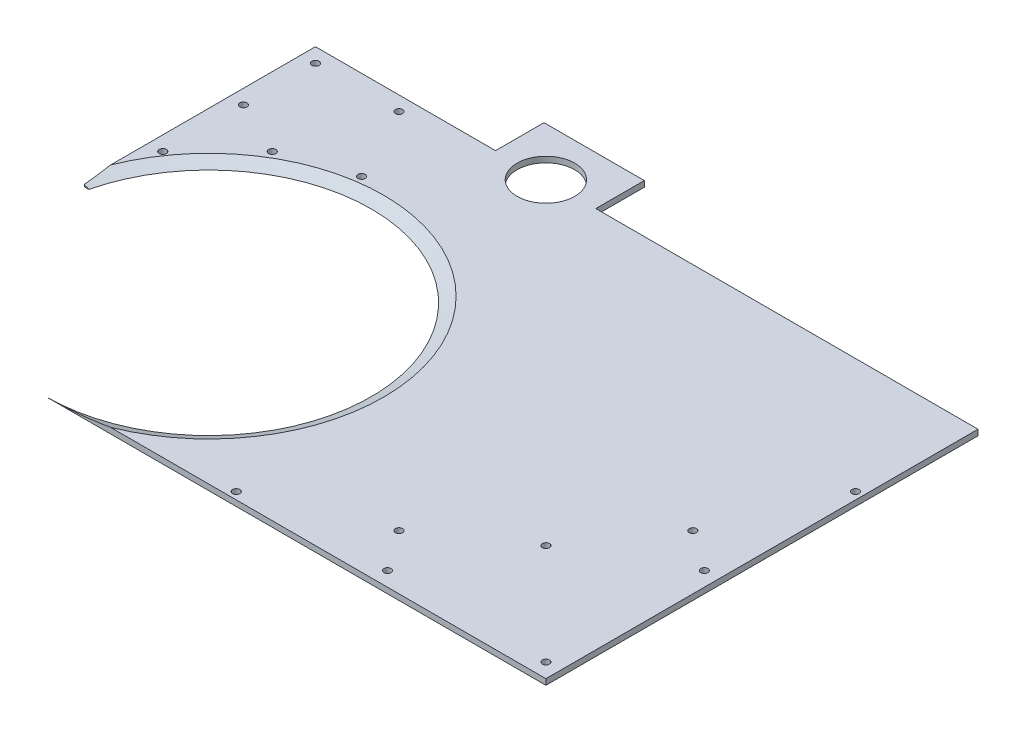
ISO-10303-21;
HEADER;
FILE_DESCRIPTION(('STEP AP214'),'2;1');
FILE_NAME('part.step','',(''),(''),'','','');
FILE_SCHEMA(('AUTOMOTIVE_DESIGN { 1 0 10303 214 1 1 1 1 }'));
ENDSEC;
DATA;
#1=APPLICATION_CONTEXT('core data for automotive mechanical design processes');
#2=APPLICATION_PROTOCOL_DEFINITION('international standard','automotive_design',2000,#1);
#3=PRODUCT_CONTEXT('',#1,'mechanical');
#4=PRODUCT('Part','Part','',(#3));
#5=PRODUCT_RELATED_PRODUCT_CATEGORY('part','',(#4));
#6=PRODUCT_DEFINITION_FORMATION('','',#4);
#7=PRODUCT_DEFINITION_CONTEXT('part definition',#1,'design');
#8=PRODUCT_DEFINITION('design','',#6,#7);
#9=PRODUCT_DEFINITION_SHAPE('','',#8);
#10=(LENGTH_UNIT() NAMED_UNIT(*) SI_UNIT(.MILLI.,.METRE.));
#11=(NAMED_UNIT(*) PLANE_ANGLE_UNIT() SI_UNIT($,.RADIAN.));
#12=(NAMED_UNIT(*) SI_UNIT($,.STERADIAN.) SOLID_ANGLE_UNIT());
#13=UNCERTAINTY_MEASURE_WITH_UNIT(LENGTH_MEASURE(1.E-05),#10,'distance_accuracy_value','');
#14=(GEOMETRIC_REPRESENTATION_CONTEXT(3) GLOBAL_UNCERTAINTY_ASSIGNED_CONTEXT((#13)) GLOBAL_UNIT_ASSIGNED_CONTEXT((#10,
#11,#12)) REPRESENTATION_CONTEXT('',''));
#15=CARTESIAN_POINT('',(0.,0.,0.));
#16=DIRECTION('',(0.,0.,1.));
#17=DIRECTION('',(1.,0.,0.));
#18=AXIS2_PLACEMENT_3D('',#15,#16,#17);
#19=CARTESIAN_POINT('',(-203.2,38.1,0.));
#20=DIRECTION('',(0.,0.,-1.));
#21=DIRECTION('',(-1.,0.,0.));
#22=AXIS2_PLACEMENT_3D('',#19,#20,#21);
#23=PLANE('',#22);
#24=DIRECTION('',(1.,0.,0.));
#25=VECTOR('',#24,1.);
#26=CARTESIAN_POINT('',(-203.2,38.1,0.));
#27=LINE('',#26,#25);
#28=CARTESIAN_POINT('',(-2.8464381738908,38.1,0.));
#29=VERTEX_POINT('',#28);
#30=CARTESIAN_POINT('',(381.,38.1,0.));
#31=VERTEX_POINT('',#30);
#32=EDGE_CURVE('E259',#29,#31,#27,.T.);
#33=ORIENTED_EDGE('',*,*,#32,.F.);
#34=CARTESIAN_POINT('',(-2.8464381738908,38.1,0.));
#35=CARTESIAN_POINT('',(-5.19891630009192,37.6950979624826,0.));
#36=CARTESIAN_POINT('',(-7.5550744164869,37.3112790542011,0.));
#37=CARTESIAN_POINT('',(-12.2743507992195,36.5883245990041,0.));
#38=CARTESIAN_POINT('',(-14.6374694133203,36.2491913247769,0.));
#39=CARTESIAN_POINT('',(-19.3656398538386,35.6187519823703,0.));
#40=CARTESIAN_POINT('',(-21.7306799700376,35.3273583940769,0.));
#41=CARTESIAN_POINT('',(-26.4663000631169,34.7939460535547,0.));
#42=CARTESIAN_POINT('',(-28.836879960786,34.5519265996604,0.));
#43=CARTESIAN_POINT('',(-33.5832522205353,34.1192539450888,0.));
#44=CARTESIAN_POINT('',(-35.9590455944232,33.9286118080349,0.));
#45=CARTESIAN_POINT('',(-40.7143004387169,33.6004543608359,0.));
#46=CARTESIAN_POINT('',(-43.093761905802,33.4629390026246,0.));
#47=CARTESIAN_POINT('',(-47.8596191736278,33.2421042931139,0.));
#48=CARTESIAN_POINT('',(-50.2460196764281,33.1588851643232,0.));
#49=CARTESIAN_POINT('',(-53.8265716244745,33.0755926672568,0.));
#50=CARTESIAN_POINT('',(-55.0202717796195,33.0547511994624,0.));
#51=CARTESIAN_POINT('',(-57.407835976874,33.0269527678862,0.));
#52=CARTESIAN_POINT('',(-58.6017000192947,33.0199958308439,0.));
#53=CARTESIAN_POINT('',(-59.7955752031906,33.0199999999999,0.));
#54=B_SPLINE_CURVE_WITH_KNOTS('',3,(#34,#35,#36,#37,#38,#39,#40,#41,#42,#43,#44,#45,#46,#47,#48,
#49,#50,#51,#52,#53),.UNSPECIFIED.,.F.,.F.,(4,2,2,2,2,2,2,2,2,4),(0.,7.16118637263134,
14.3227368190655,21.4710075700052,28.61917672839,35.7688839502196,42.9185847033745,
50.0814456483104,53.6630219259592,57.2446051011548),.UNSPECIFIED.);
#55=CARTESIAN_POINT('',(-59.7955752031906,33.02,0.));
#56=VERTEX_POINT('',#55);
#57=EDGE_CURVE('E60',#29,#56,#54,.T.);
#58=ORIENTED_EDGE('',*,*,#57,.T.);
#59=DIRECTION('',(1.,0.,0.));
#60=VECTOR('',#59,1.);
#61=CARTESIAN_POINT('',(-203.2,33.02,0.));
#62=LINE('',#61,#60);
#63=CARTESIAN_POINT('',(381.,33.02,0.));
#64=VERTEX_POINT('',#63);
#65=EDGE_CURVE('E135',#56,#64,#62,.T.);
#66=ORIENTED_EDGE('',*,*,#65,.T.);
#67=DIRECTION('',(0.,-1.,0.));
#68=VECTOR('',#67,1.);
#69=CARTESIAN_POINT('',(381.,38.1,0.));
#70=LINE('',#69,#68);
#71=EDGE_CURVE('E174',#31,#64,#70,.T.);
#72=ORIENTED_EDGE('',*,*,#71,.F.);
#73=EDGE_LOOP('',(#33,#58,#66,#72));
#74=FACE_BOUND('',#73,.T.);
#75=ADVANCED_FACE('F33',(#74),#23,.F.);
#76=CARTESIAN_POINT('',(0.,38.1,0.));
#77=DIRECTION('',(0.,1.,0.));
#78=DIRECTION('',(0.,0.,1.));
#79=AXIS2_PLACEMENT_3D('',#76,#77,#78);
#80=PLANE('',#79);
#81=CARTESIAN_POINT('',(-190.5,38.1,-233.68));
#82=DIRECTION('',(0.,1.,0.));
#83=DIRECTION('',(0.,0.,1.));
#84=AXIS2_PLACEMENT_3D('',#81,#82,#83);
#85=CIRCLE('',#84,3.17499999999997);
#86=CARTESIAN_POINT('',(-190.5,38.1,-230.505));
#87=VERTEX_POINT('',#86);
#88=EDGE_CURVE('E343',#87,#87,#85,.T.);
#89=ORIENTED_EDGE('',*,*,#88,.F.);
#90=EDGE_LOOP('',(#89));
#91=FACE_BOUND('',#90,.T.);
#92=CARTESIAN_POINT('',(-190.5,38.1,-304.8));
#93=DIRECTION('',(0.,1.,0.));
#94=DIRECTION('',(0.,0.,1.));
#95=AXIS2_PLACEMENT_3D('',#92,#93,#94);
#96=CIRCLE('',#95,3.17499999999997);
#97=CARTESIAN_POINT('',(-190.5,38.1,-301.625));
#98=VERTEX_POINT('',#97);
#99=EDGE_CURVE('E337',#98,#98,#96,.T.);
#100=ORIENTED_EDGE('',*,*,#99,.F.);
#101=EDGE_LOOP('',(#100));
#102=FACE_BOUND('',#101,.T.);
#103=CARTESIAN_POINT('',(-142.24,38.1,-281.94));
#104=DIRECTION('',(0.,1.,0.));
#105=DIRECTION('',(0.,0.,1.));
#106=AXIS2_PLACEMENT_3D('',#103,#104,#105);
#107=CIRCLE('',#106,3.175);
#108=CARTESIAN_POINT('',(-142.24,38.1,-278.765));
#109=VERTEX_POINT('',#108);
#110=EDGE_CURVE('E331',#109,#109,#107,.T.);
#111=ORIENTED_EDGE('',*,*,#110,.F.);
#112=EDGE_LOOP('',(#111));
#113=FACE_BOUND('',#112,.T.);
#114=CARTESIAN_POINT('',(-83.82,38.1,-302.26));
#115=DIRECTION('',(0.,1.,0.));
#116=DIRECTION('',(0.,0.,1.));
#117=AXIS2_PLACEMENT_3D('',#114,#115,#116);
#118=CIRCLE('',#117,3.175);
#119=CARTESIAN_POINT('',(-83.82,38.1,-299.085));
#120=VERTEX_POINT('',#119);
#121=EDGE_CURVE('E325',#120,#120,#118,.T.);
#122=ORIENTED_EDGE('',*,*,#121,.F.);
#123=EDGE_LOOP('',(#122));
#124=FACE_BOUND('',#123,.T.);
#125=CARTESIAN_POINT('',(-116.84,38.1,-368.3));
#126=DIRECTION('',(0.,1.,0.));
#127=DIRECTION('',(0.,0.,1.));
#128=AXIS2_PLACEMENT_3D('',#125,#126,#127);
#129=CIRCLE('',#128,3.175);
#130=CARTESIAN_POINT('',(-116.84,38.1,-365.125));
#131=VERTEX_POINT('',#130);
#132=EDGE_CURVE('E319',#131,#131,#129,.T.);
#133=ORIENTED_EDGE('',*,*,#132,.F.);
#134=EDGE_LOOP('',(#133));
#135=FACE_BOUND('',#134,.T.);
#136=CARTESIAN_POINT('',(-190.5,38.1,-368.3));
#137=DIRECTION('',(0.,1.,0.));
#138=DIRECTION('',(0.,0.,1.));
#139=AXIS2_PLACEMENT_3D('',#136,#137,#138);
#140=CIRCLE('',#139,3.17499999999997);
#141=CARTESIAN_POINT('',(-190.5,38.1,-365.125));
#142=VERTEX_POINT('',#141);
#143=EDGE_CURVE('E313',#142,#142,#140,.T.);
#144=ORIENTED_EDGE('',*,*,#143,.F.);
#145=EDGE_LOOP('',(#144));
#146=FACE_BOUND('',#145,.T.);
#147=CARTESIAN_POINT('',(368.3,38.1,-12.7));
#148=DIRECTION('',(0.,1.,0.));
#149=DIRECTION('',(0.,0.,1.));
#150=AXIS2_PLACEMENT_3D('',#147,#148,#149);
#151=CIRCLE('',#150,3.17500000000003);
#152=CARTESIAN_POINT('',(368.3,38.1,-9.52499999999997));
#153=VERTEX_POINT('',#152);
#154=EDGE_CURVE('E307',#153,#153,#151,.T.);
#155=ORIENTED_EDGE('',*,*,#154,.F.);
#156=EDGE_LOOP('',(#155));
#157=FACE_BOUND('',#156,.T.);
#158=CARTESIAN_POINT('',(228.6,38.1,-12.7));
#159=DIRECTION('',(0.,1.,0.));
#160=DIRECTION('',(0.,0.,1.));
#161=AXIS2_PLACEMENT_3D('',#158,#159,#160);
#162=CIRCLE('',#161,3.175);
#163=CARTESIAN_POINT('',(228.6,38.1,-9.525));
#164=VERTEX_POINT('',#163);
#165=EDGE_CURVE('E301',#164,#164,#162,.T.);
#166=ORIENTED_EDGE('',*,*,#165,.F.);
#167=EDGE_LOOP('',(#166));
#168=FACE_BOUND('',#167,.T.);
#169=CARTESIAN_POINT('',(203.2,38.1,-48.26));
#170=DIRECTION('',(0.,1.,0.));
#171=DIRECTION('',(0.,0.,1.));
#172=AXIS2_PLACEMENT_3D('',#169,#170,#171);
#173=CIRCLE('',#172,3.175);
#174=CARTESIAN_POINT('',(203.2,38.1,-45.085));
#175=VERTEX_POINT('',#174);
#176=EDGE_CURVE('E295',#175,#175,#173,.T.);
#177=ORIENTED_EDGE('',*,*,#176,.F.);
#178=EDGE_LOOP('',(#177));
#179=FACE_BOUND('',#178,.T.);
#180=CARTESIAN_POINT('',(101.6,38.1,-6.35));
#181=DIRECTION('',(0.,1.,0.));
#182=DIRECTION('',(0.,0.,1.));
#183=AXIS2_PLACEMENT_3D('',#180,#181,#182);
#184=CIRCLE('',#183,3.175);
#185=CARTESIAN_POINT('',(101.6,38.1,-3.175));
#186=VERTEX_POINT('',#185);
#187=EDGE_CURVE('E289',#186,#186,#184,.T.);
#188=ORIENTED_EDGE('',*,*,#187,.F.);
#189=EDGE_LOOP('',(#188));
#190=FACE_BOUND('',#189,.T.);
#191=CARTESIAN_POINT('',(279.4,38.1,-101.6));
#192=DIRECTION('',(0.,1.,0.));
#193=DIRECTION('',(0.,0.,1.));
#194=AXIS2_PLACEMENT_3D('',#191,#192,#193);
#195=CIRCLE('',#194,3.17499999999997);
#196=CARTESIAN_POINT('',(279.4,38.1,-98.425));
#197=VERTEX_POINT('',#196);
#198=EDGE_CURVE('E283',#197,#197,#195,.T.);
#199=ORIENTED_EDGE('',*,*,#198,.F.);
#200=EDGE_LOOP('',(#199));
#201=FACE_BOUND('',#200,.T.);
#202=CARTESIAN_POINT('',(332.74,38.1,-177.8));
#203=DIRECTION('',(0.,1.,0.));
#204=DIRECTION('',(0.,0.,1.));
#205=AXIS2_PLACEMENT_3D('',#202,#203,#204);
#206=CIRCLE('',#205,3.17500000000003);
#207=CARTESIAN_POINT('',(332.74,38.1,-174.625));
#208=VERTEX_POINT('',#207);
#209=EDGE_CURVE('E277',#208,#208,#206,.T.);
#210=ORIENTED_EDGE('',*,*,#209,.F.);
#211=EDGE_LOOP('',(#210));
#212=FACE_BOUND('',#211,.T.);
#213=CARTESIAN_POINT('',(374.65,38.1,-279.4));
#214=DIRECTION('',(0.,1.,0.));
#215=DIRECTION('',(0.,0.,1.));
#216=AXIS2_PLACEMENT_3D('',#213,#214,#215);
#217=CIRCLE('',#216,3.17499999999997);
#218=CARTESIAN_POINT('',(374.65,38.1,-276.225));
#219=VERTEX_POINT('',#218);
#220=EDGE_CURVE('E271',#219,#219,#217,.T.);
#221=ORIENTED_EDGE('',*,*,#220,.F.);
#222=EDGE_LOOP('',(#221));
#223=FACE_BOUND('',#222,.T.);
#224=CARTESIAN_POINT('',(368.3,38.1,-152.4));
#225=DIRECTION('',(0.,1.,0.));
#226=DIRECTION('',(0.,0.,1.));
#227=AXIS2_PLACEMENT_3D('',#224,#225,#226);
#228=CIRCLE('',#227,3.17499999999997);
#229=CARTESIAN_POINT('',(368.3,38.1,-149.225));
#230=VERTEX_POINT('',#229);
#231=EDGE_CURVE('E265',#230,#230,#228,.T.);
#232=ORIENTED_EDGE('',*,*,#231,.F.);
#233=EDGE_LOOP('',(#232));
#234=FACE_BOUND('',#233,.T.);
#235=CARTESIAN_POINT('',(0.,38.1,-381.));
#236=DIRECTION('',(0.,1.,0.));
#237=DIRECTION('',(0.,0.,1.));
#238=AXIS2_PLACEMENT_3D('',#235,#236,#237);
#239=CIRCLE('',#238,25.4);
#240=CARTESIAN_POINT('',(0.,38.1,-355.6));
#241=VERTEX_POINT('',#240);
#242=EDGE_CURVE('E136',#241,#241,#239,.T.);
#243=ORIENTED_EDGE('',*,*,#242,.F.);
#244=EDGE_LOOP('',(#243));
#245=FACE_BOUND('',#244,.T.);
#246=DIRECTION('',(0.,0.,1.));
#247=VECTOR('',#246,1.);
#248=CARTESIAN_POINT('',(-203.2,38.1,-381.));
#249=LINE('',#248,#247);
#250=CARTESIAN_POINT('',(-203.2,38.1,-381.));
#251=VERTEX_POINT('',#250);
#252=CARTESIAN_POINT('',(-203.2,38.1,-200.353561826109));
#253=VERTEX_POINT('',#252);
#254=EDGE_CURVE('E157',#251,#253,#249,.T.);
#255=ORIENTED_EDGE('',*,*,#254,.T.);
#256=CARTESIAN_POINT('',(-59.7955752031906,38.1,-143.404424796809));
#257=DIRECTION('',(0.,1.,0.));
#258=DIRECTION('',(0.,0.,1.));
#259=AXIS2_PLACEMENT_3D('',#256,#257,#258);
#260=CIRCLE('',#259,154.298519952998);
#261=EDGE_CURVE('E178',#253,#29,#260,.F.);
#262=ORIENTED_EDGE('',*,*,#261,.T.);
#263=ORIENTED_EDGE('',*,*,#32,.T.);
#264=DIRECTION('',(0.,0.,-1.));
#265=VECTOR('',#264,1.);
#266=CARTESIAN_POINT('',(381.,38.1,-381.));
#267=LINE('',#266,#265);
#268=CARTESIAN_POINT('',(381.,38.1,-381.));
#269=VERTEX_POINT('',#268);
#270=EDGE_CURVE('E257',#31,#269,#267,.T.);
#271=ORIENTED_EDGE('',*,*,#270,.T.);
#272=DIRECTION('',(-1.,0.,0.));
#273=VECTOR('',#272,1.);
#274=CARTESIAN_POINT('',(44.0205587624334,38.1,-381.));
#275=LINE('',#274,#273);
#276=CARTESIAN_POINT('',(44.0205587624334,38.1,-381.));
#277=VERTEX_POINT('',#276);
#278=EDGE_CURVE('E255',#269,#277,#275,.T.);
#279=ORIENTED_EDGE('',*,*,#278,.T.);
#280=DIRECTION('',(0.,0.,-1.));
#281=VECTOR('',#280,1.);
#282=CARTESIAN_POINT('',(44.0205587624334,38.1,-381.));
#283=LINE('',#282,#281);
#284=CARTESIAN_POINT('',(44.0205587624334,38.1,-423.747508854447));
#285=VERTEX_POINT('',#284);
#286=EDGE_CURVE('E241',#277,#285,#283,.T.);
#287=ORIENTED_EDGE('',*,*,#286,.T.);
#288=DIRECTION('',(-1.,0.,0.));
#289=VECTOR('',#288,1.);
#290=CARTESIAN_POINT('',(-44.423028515908,38.1,-423.747508854447));
#291=LINE('',#290,#289);
#292=CARTESIAN_POINT('',(-44.423028515908,38.1,-423.747508854447));
#293=VERTEX_POINT('',#292);
#294=EDGE_CURVE('E251',#285,#293,#291,.T.);
#295=ORIENTED_EDGE('',*,*,#294,.T.);
#296=DIRECTION('',(0.,0.,1.));
#297=VECTOR('',#296,1.);
#298=CARTESIAN_POINT('',(-44.423028515908,38.1,-381.));
#299=LINE('',#298,#297);
#300=CARTESIAN_POINT('',(-44.423028515908,38.1,-381.));
#301=VERTEX_POINT('',#300);
#302=EDGE_CURVE('E248',#293,#301,#299,.T.);
#303=ORIENTED_EDGE('',*,*,#302,.T.);
#304=DIRECTION('',(-1.,0.,0.));
#305=VECTOR('',#304,1.);
#306=CARTESIAN_POINT('',(-203.2,38.1,-381.));
#307=LINE('',#306,#305);
#308=EDGE_CURVE('E143',#301,#251,#307,.T.);
#309=ORIENTED_EDGE('',*,*,#308,.T.);
#310=EDGE_LOOP('',(#255,#262,#263,#271,#279,#287,#295,#303,#309));
#311=FACE_BOUND('',#310,.T.);
#312=ADVANCED_FACE('F190',(#91,#102,#113,#124,#135,#146,#157,#168,#179,#190,#201,#212,#223,#234,
#245,#311),#80,.T.);
#313=CARTESIAN_POINT('',(0.,33.02,0.));
#314=DIRECTION('',(0.,1.,0.));
#315=DIRECTION('',(0.,0.,1.));
#316=AXIS2_PLACEMENT_3D('',#313,#314,#315);
#317=PLANE('',#316);
#318=CARTESIAN_POINT('',(-190.5,33.02,-233.68));
#319=DIRECTION('',(0.,1.,0.));
#320=DIRECTION('',(0.,0.,1.));
#321=AXIS2_PLACEMENT_3D('',#318,#319,#320);
#322=CIRCLE('',#321,3.17499999999997);
#323=CARTESIAN_POINT('',(-190.5,33.02,-230.505));
#324=VERTEX_POINT('',#323);
#325=EDGE_CURVE('E340',#324,#324,#322,.T.);
#326=ORIENTED_EDGE('',*,*,#325,.T.);
#327=EDGE_LOOP('',(#326));
#328=FACE_BOUND('',#327,.T.);
#329=CARTESIAN_POINT('',(-190.5,33.02,-304.8));
#330=DIRECTION('',(0.,1.,0.));
#331=DIRECTION('',(0.,0.,1.));
#332=AXIS2_PLACEMENT_3D('',#329,#330,#331);
#333=CIRCLE('',#332,3.17499999999997);
#334=CARTESIAN_POINT('',(-190.5,33.02,-301.625));
#335=VERTEX_POINT('',#334);
#336=EDGE_CURVE('E334',#335,#335,#333,.T.);
#337=ORIENTED_EDGE('',*,*,#336,.T.);
#338=EDGE_LOOP('',(#337));
#339=FACE_BOUND('',#338,.T.);
#340=CARTESIAN_POINT('',(-142.24,33.02,-281.94));
#341=DIRECTION('',(0.,1.,0.));
#342=DIRECTION('',(0.,0.,1.));
#343=AXIS2_PLACEMENT_3D('',#340,#341,#342);
#344=CIRCLE('',#343,3.175);
#345=CARTESIAN_POINT('',(-142.24,33.02,-278.765));
#346=VERTEX_POINT('',#345);
#347=EDGE_CURVE('E328',#346,#346,#344,.T.);
#348=ORIENTED_EDGE('',*,*,#347,.T.);
#349=EDGE_LOOP('',(#348));
#350=FACE_BOUND('',#349,.T.);
#351=CARTESIAN_POINT('',(-83.82,33.02,-302.26));
#352=DIRECTION('',(0.,1.,0.));
#353=DIRECTION('',(0.,0.,1.));
#354=AXIS2_PLACEMENT_3D('',#351,#352,#353);
#355=CIRCLE('',#354,3.175);
#356=CARTESIAN_POINT('',(-83.82,33.02,-299.085));
#357=VERTEX_POINT('',#356);
#358=EDGE_CURVE('E322',#357,#357,#355,.T.);
#359=ORIENTED_EDGE('',*,*,#358,.T.);
#360=EDGE_LOOP('',(#359));
#361=FACE_BOUND('',#360,.T.);
#362=CARTESIAN_POINT('',(-116.84,33.02,-368.3));
#363=DIRECTION('',(0.,1.,0.));
#364=DIRECTION('',(0.,0.,1.));
#365=AXIS2_PLACEMENT_3D('',#362,#363,#364);
#366=CIRCLE('',#365,3.175);
#367=CARTESIAN_POINT('',(-116.84,33.02,-365.125));
#368=VERTEX_POINT('',#367);
#369=EDGE_CURVE('E316',#368,#368,#366,.T.);
#370=ORIENTED_EDGE('',*,*,#369,.T.);
#371=EDGE_LOOP('',(#370));
#372=FACE_BOUND('',#371,.T.);
#373=CARTESIAN_POINT('',(-190.5,33.02,-368.3));
#374=DIRECTION('',(0.,1.,0.));
#375=DIRECTION('',(0.,0.,1.));
#376=AXIS2_PLACEMENT_3D('',#373,#374,#375);
#377=CIRCLE('',#376,3.17499999999997);
#378=CARTESIAN_POINT('',(-190.5,33.02,-365.125));
#379=VERTEX_POINT('',#378);
#380=EDGE_CURVE('E310',#379,#379,#377,.T.);
#381=ORIENTED_EDGE('',*,*,#380,.T.);
#382=EDGE_LOOP('',(#381));
#383=FACE_BOUND('',#382,.T.);
#384=CARTESIAN_POINT('',(368.3,33.02,-12.7));
#385=DIRECTION('',(0.,1.,0.));
#386=DIRECTION('',(0.,0.,1.));
#387=AXIS2_PLACEMENT_3D('',#384,#385,#386);
#388=CIRCLE('',#387,3.17500000000003);
#389=CARTESIAN_POINT('',(368.3,33.02,-9.52499999999997));
#390=VERTEX_POINT('',#389);
#391=EDGE_CURVE('E304',#390,#390,#388,.T.);
#392=ORIENTED_EDGE('',*,*,#391,.T.);
#393=EDGE_LOOP('',(#392));
#394=FACE_BOUND('',#393,.T.);
#395=CARTESIAN_POINT('',(228.6,33.02,-12.7));
#396=DIRECTION('',(0.,1.,0.));
#397=DIRECTION('',(0.,0.,1.));
#398=AXIS2_PLACEMENT_3D('',#395,#396,#397);
#399=CIRCLE('',#398,3.175);
#400=CARTESIAN_POINT('',(228.6,33.02,-9.525));
#401=VERTEX_POINT('',#400);
#402=EDGE_CURVE('E298',#401,#401,#399,.T.);
#403=ORIENTED_EDGE('',*,*,#402,.T.);
#404=EDGE_LOOP('',(#403));
#405=FACE_BOUND('',#404,.T.);
#406=CARTESIAN_POINT('',(203.2,33.02,-48.26));
#407=DIRECTION('',(0.,1.,0.));
#408=DIRECTION('',(0.,0.,1.));
#409=AXIS2_PLACEMENT_3D('',#406,#407,#408);
#410=CIRCLE('',#409,3.175);
#411=CARTESIAN_POINT('',(203.2,33.02,-45.085));
#412=VERTEX_POINT('',#411);
#413=EDGE_CURVE('E292',#412,#412,#410,.T.);
#414=ORIENTED_EDGE('',*,*,#413,.T.);
#415=EDGE_LOOP('',(#414));
#416=FACE_BOUND('',#415,.T.);
#417=CARTESIAN_POINT('',(101.6,33.02,-6.35));
#418=DIRECTION('',(0.,1.,0.));
#419=DIRECTION('',(0.,0.,1.));
#420=AXIS2_PLACEMENT_3D('',#417,#418,#419);
#421=CIRCLE('',#420,3.175);
#422=CARTESIAN_POINT('',(101.6,33.02,-3.175));
#423=VERTEX_POINT('',#422);
#424=EDGE_CURVE('E286',#423,#423,#421,.T.);
#425=ORIENTED_EDGE('',*,*,#424,.T.);
#426=EDGE_LOOP('',(#425));
#427=FACE_BOUND('',#426,.T.);
#428=CARTESIAN_POINT('',(279.4,33.02,-101.6));
#429=DIRECTION('',(0.,1.,0.));
#430=DIRECTION('',(0.,0.,1.));
#431=AXIS2_PLACEMENT_3D('',#428,#429,#430);
#432=CIRCLE('',#431,3.17499999999997);
#433=CARTESIAN_POINT('',(279.4,33.02,-98.425));
#434=VERTEX_POINT('',#433);
#435=EDGE_CURVE('E280',#434,#434,#432,.T.);
#436=ORIENTED_EDGE('',*,*,#435,.T.);
#437=EDGE_LOOP('',(#436));
#438=FACE_BOUND('',#437,.T.);
#439=CARTESIAN_POINT('',(332.74,33.02,-177.8));
#440=DIRECTION('',(0.,1.,0.));
#441=DIRECTION('',(0.,0.,1.));
#442=AXIS2_PLACEMENT_3D('',#439,#440,#441);
#443=CIRCLE('',#442,3.17500000000003);
#444=CARTESIAN_POINT('',(332.74,33.02,-174.625));
#445=VERTEX_POINT('',#444);
#446=EDGE_CURVE('E274',#445,#445,#443,.T.);
#447=ORIENTED_EDGE('',*,*,#446,.T.);
#448=EDGE_LOOP('',(#447));
#449=FACE_BOUND('',#448,.T.);
#450=CARTESIAN_POINT('',(374.65,33.02,-279.4));
#451=DIRECTION('',(0.,1.,0.));
#452=DIRECTION('',(0.,0.,1.));
#453=AXIS2_PLACEMENT_3D('',#450,#451,#452);
#454=CIRCLE('',#453,3.17499999999997);
#455=CARTESIAN_POINT('',(374.65,33.02,-276.225));
#456=VERTEX_POINT('',#455);
#457=EDGE_CURVE('E268',#456,#456,#454,.T.);
#458=ORIENTED_EDGE('',*,*,#457,.T.);
#459=EDGE_LOOP('',(#458));
#460=FACE_BOUND('',#459,.T.);
#461=CARTESIAN_POINT('',(368.3,33.02,-152.4));
#462=DIRECTION('',(0.,1.,0.));
#463=DIRECTION('',(0.,0.,1.));
#464=AXIS2_PLACEMENT_3D('',#461,#462,#463);
#465=CIRCLE('',#464,3.17499999999997);
#466=CARTESIAN_POINT('',(368.3,33.02,-149.225));
#467=VERTEX_POINT('',#466);
#468=EDGE_CURVE('E118',#467,#467,#465,.T.);
#469=ORIENTED_EDGE('',*,*,#468,.T.);
#470=EDGE_LOOP('',(#469));
#471=FACE_BOUND('',#470,.T.);
#472=CARTESIAN_POINT('',(0.,33.02,-381.));
#473=DIRECTION('',(0.,-1.,0.));
#474=DIRECTION('',(0.,0.,-1.));
#475=AXIS2_PLACEMENT_3D('',#472,#473,#474);
#476=CIRCLE('',#475,25.4);
#477=CARTESIAN_POINT('',(0.,33.02,-406.4));
#478=VERTEX_POINT('',#477);
#479=EDGE_CURVE('E128',#478,#478,#476,.T.);
#480=ORIENTED_EDGE('',*,*,#479,.F.);
#481=EDGE_LOOP('',(#480));
#482=FACE_BOUND('',#481,.T.);
#483=CARTESIAN_POINT('',(-59.7955752031906,33.02,-143.404424796809));
#484=DIRECTION('',(0.,1.,0.));
#485=DIRECTION('',(0.,0.,1.));
#486=AXIS2_PLACEMENT_3D('',#483,#484,#485);
#487=CIRCLE('',#486,143.404424796809);
#488=CARTESIAN_POINT('',(-199.164171118138,33.02,-177.186424796809));
#489=VERTEX_POINT('',#488);
#490=EDGE_CURVE('E127',#489,#56,#487,.F.);
#491=ORIENTED_EDGE('',*,*,#490,.F.);
#492=DIRECTION('',(-1.,0.,0.));
#493=VECTOR('',#492,1.);
#494=CARTESIAN_POINT('',(-177.8,33.02,-177.186424796809));
#495=LINE('',#494,#493);
#496=CARTESIAN_POINT('',(-203.2,33.02,-177.186424796809));
#497=VERTEX_POINT('',#496);
#498=EDGE_CURVE('E52',#489,#497,#495,.T.);
#499=ORIENTED_EDGE('',*,*,#498,.T.);
#500=DIRECTION('',(0.,0.,1.));
#501=VECTOR('',#500,1.);
#502=CARTESIAN_POINT('',(-203.2,33.02,-381.));
#503=LINE('',#502,#501);
#504=CARTESIAN_POINT('',(-203.2,33.02,-381.));
#505=VERTEX_POINT('',#504);
#506=EDGE_CURVE('E125',#505,#497,#503,.T.);
#507=ORIENTED_EDGE('',*,*,#506,.F.);
#508=DIRECTION('',(-1.,0.,0.));
#509=VECTOR('',#508,1.);
#510=CARTESIAN_POINT('',(-203.2,33.02,-381.));
#511=LINE('',#510,#509);
#512=CARTESIAN_POINT('',(-44.423028515908,33.02,-381.));
#513=VERTEX_POINT('',#512);
#514=EDGE_CURVE('E155',#513,#505,#511,.T.);
#515=ORIENTED_EDGE('',*,*,#514,.F.);
#516=DIRECTION('',(0.,0.,1.));
#517=VECTOR('',#516,1.);
#518=CARTESIAN_POINT('',(-44.423028515908,33.02,-381.));
#519=LINE('',#518,#517);
#520=CARTESIAN_POINT('',(-44.423028515908,33.02,-423.747508854447));
#521=VERTEX_POINT('',#520);
#522=EDGE_CURVE('E153',#521,#513,#519,.T.);
#523=ORIENTED_EDGE('',*,*,#522,.F.);
#524=DIRECTION('',(-1.,0.,0.));
#525=VECTOR('',#524,1.);
#526=CARTESIAN_POINT('',(-44.423028515908,33.02,-423.747508854447));
#527=LINE('',#526,#525);
#528=CARTESIAN_POINT('',(44.0205587624334,33.02,-423.747508854447));
#529=VERTEX_POINT('',#528);
#530=EDGE_CURVE('E151',#529,#521,#527,.T.);
#531=ORIENTED_EDGE('',*,*,#530,.F.);
#532=DIRECTION('',(0.,0.,-1.));
#533=VECTOR('',#532,1.);
#534=CARTESIAN_POINT('',(44.0205587624334,33.02,-381.));
#535=LINE('',#534,#533);
#536=CARTESIAN_POINT('',(44.0205587624334,33.02,-381.));
#537=VERTEX_POINT('',#536);
#538=EDGE_CURVE('E149',#537,#529,#535,.T.);
#539=ORIENTED_EDGE('',*,*,#538,.F.);
#540=DIRECTION('',(-1.,0.,0.));
#541=VECTOR('',#540,1.);
#542=CARTESIAN_POINT('',(44.0205587624334,33.02,-381.));
#543=LINE('',#542,#541);
#544=CARTESIAN_POINT('',(381.,33.02,-381.));
#545=VERTEX_POINT('',#544);
#546=EDGE_CURVE('E147',#545,#537,#543,.T.);
#547=ORIENTED_EDGE('',*,*,#546,.F.);
#548=DIRECTION('',(0.,0.,-1.));
#549=VECTOR('',#548,1.);
#550=CARTESIAN_POINT('',(381.,33.02,-381.));
#551=LINE('',#550,#549);
#552=EDGE_CURVE('E138',#64,#545,#551,.T.);
#553=ORIENTED_EDGE('',*,*,#552,.F.);
#554=ORIENTED_EDGE('',*,*,#65,.F.);
#555=EDGE_LOOP('',(#491,#499,#507,#515,#523,#531,#539,#547,#553,#554));
#556=FACE_BOUND('',#555,.T.);
#557=ADVANCED_FACE('F123',(#328,#339,#350,#361,#372,#383,#394,#405,#416,#427,#438,#449,#460,
#471,#482,#556),#317,.F.);
#558=CARTESIAN_POINT('',(-203.2,38.1,-381.));
#559=DIRECTION('',(1.,0.,0.));
#560=DIRECTION('',(0.,0.,-1.));
#561=AXIS2_PLACEMENT_3D('',#558,#559,#560);
#562=PLANE('',#561);
#563=ORIENTED_EDGE('',*,*,#506,.T.);
#564=DIRECTION('',(0.,-1.,0.));
#565=VECTOR('',#564,1.);
#566=CARTESIAN_POINT('',(-203.2,33.02,-177.186424796809));
#567=LINE('',#566,#565);
#568=CARTESIAN_POINT('',(-203.2,34.850404993847,-177.186424796809));
#569=VERTEX_POINT('',#568);
#570=EDGE_CURVE('E113',#569,#497,#567,.T.);
#571=ORIENTED_EDGE('',*,*,#570,.F.);
#572=CARTESIAN_POINT('',(-203.2,33.02,-143.404424796809));
#573=CARTESIAN_POINT('',(-203.2,33.0199958308439,-144.598299980705));
#574=CARTESIAN_POINT('',(-203.2,33.0269527678862,-145.792164023126));
#575=CARTESIAN_POINT('',(-203.2,33.0547511994624,-148.17972822038));
#576=CARTESIAN_POINT('',(-203.2,33.0755926672569,-149.373428375525));
#577=CARTESIAN_POINT('',(-203.2,33.1588851643232,-152.953980323572));
#578=CARTESIAN_POINT('',(-203.2,33.242104293114,-155.340380826372));
#579=CARTESIAN_POINT('',(-203.2,33.4629390026247,-160.106238094198));
#580=CARTESIAN_POINT('',(-203.2,33.6004543608359,-162.485699561283));
#581=CARTESIAN_POINT('',(-203.2,33.928611808035,-167.240954405576));
#582=CARTESIAN_POINT('',(-203.2,34.1192539450889,-169.616747779464));
#583=CARTESIAN_POINT('',(-203.2,34.5519265996604,-174.363120039214));
#584=CARTESIAN_POINT('',(-203.2,34.7939460535547,-176.733699936883));
#585=CARTESIAN_POINT('',(-203.2,35.327358394077,-181.469320029962));
#586=CARTESIAN_POINT('',(-203.2,35.6187519823704,-183.834360146161));
#587=CARTESIAN_POINT('',(-203.2,36.2491913247769,-188.562530586679));
#588=CARTESIAN_POINT('',(-203.2,36.5883245990041,-190.92564920078));
#589=CARTESIAN_POINT('',(-203.2,37.3112790542012,-195.644925583513));
#590=CARTESIAN_POINT('',(-203.2,37.6950979624826,-198.001083699908));
#591=CARTESIAN_POINT('',(-203.2,38.1,-200.353561826109));
#592=B_SPLINE_CURVE_WITH_KNOTS('',3,(#572,#573,#574,#575,#576,#577,#578,#579,#580,#581,#582,
#583,#584,#585,#586,#587,#588,#589,#590,#591),.UNSPECIFIED.,.F.,.F.,(4,2,2,2,2,2,2,2,2,4),(0.,
3.58158317519555,7.16315945284434,14.3260203977802,21.4757211509352,28.6254283727647,
35.7735975311495,42.9218682820891,50.0834187285232,57.2446051011545),.UNSPECIFIED.);
#593=EDGE_CURVE('E46',#569,#253,#592,.T.);
#594=ORIENTED_EDGE('',*,*,#593,.T.);
#595=ORIENTED_EDGE('',*,*,#254,.F.);
#596=DIRECTION('',(0.,-1.,0.));
#597=VECTOR('',#596,1.);
#598=CARTESIAN_POINT('',(-203.2,38.1,-381.));
#599=LINE('',#598,#597);
#600=EDGE_CURVE('E134',#251,#505,#599,.T.);
#601=ORIENTED_EDGE('',*,*,#600,.T.);
#602=EDGE_LOOP('',(#563,#571,#594,#595,#601));
#603=FACE_BOUND('',#602,.T.);
#604=ADVANCED_FACE('F131',(#603),#562,.F.);
#605=CARTESIAN_POINT('',(381.,38.1,-381.));
#606=DIRECTION('',(-1.,0.,0.));
#607=DIRECTION('',(0.,0.,1.));
#608=AXIS2_PLACEMENT_3D('',#605,#606,#607);
#609=PLANE('',#608);
#610=ORIENTED_EDGE('',*,*,#552,.T.);
#611=DIRECTION('',(0.,-1.,0.));
#612=VECTOR('',#611,1.);
#613=CARTESIAN_POINT('',(381.,38.1,-381.));
#614=LINE('',#613,#612);
#615=EDGE_CURVE('E171',#269,#545,#614,.T.);
#616=ORIENTED_EDGE('',*,*,#615,.F.);
#617=ORIENTED_EDGE('',*,*,#270,.F.);
#618=ORIENTED_EDGE('',*,*,#71,.T.);
#619=EDGE_LOOP('',(#610,#616,#617,#618));
#620=FACE_BOUND('',#619,.T.);
#621=ADVANCED_FACE('F192',(#620),#609,.F.);
#622=CARTESIAN_POINT('',(44.0205587624334,38.1,-381.));
#623=DIRECTION('',(0.,0.,1.));
#624=DIRECTION('',(1.,0.,0.));
#625=AXIS2_PLACEMENT_3D('',#622,#623,#624);
#626=PLANE('',#625);
#627=ORIENTED_EDGE('',*,*,#546,.T.);
#628=DIRECTION('',(0.,-1.,0.));
#629=VECTOR('',#628,1.);
#630=CARTESIAN_POINT('',(44.0205587624334,38.1,-381.));
#631=LINE('',#630,#629);
#632=EDGE_CURVE('E168',#277,#537,#631,.T.);
#633=ORIENTED_EDGE('',*,*,#632,.F.);
#634=ORIENTED_EDGE('',*,*,#278,.F.);
#635=ORIENTED_EDGE('',*,*,#615,.T.);
#636=EDGE_LOOP('',(#627,#633,#634,#635));
#637=FACE_BOUND('',#636,.T.);
#638=ADVANCED_FACE('F200',(#637),#626,.F.);
#639=CARTESIAN_POINT('',(44.0205587624334,38.1,-381.));
#640=DIRECTION('',(-1.,0.,0.));
#641=DIRECTION('',(0.,0.,1.));
#642=AXIS2_PLACEMENT_3D('',#639,#640,#641);
#643=PLANE('',#642);
#644=ORIENTED_EDGE('',*,*,#538,.T.);
#645=DIRECTION('',(0.,-1.,0.));
#646=VECTOR('',#645,1.);
#647=CARTESIAN_POINT('',(44.0205587624334,38.1,-423.747508854447));
#648=LINE('',#647,#646);
#649=EDGE_CURVE('E165',#285,#529,#648,.T.);
#650=ORIENTED_EDGE('',*,*,#649,.F.);
#651=ORIENTED_EDGE('',*,*,#286,.F.);
#652=ORIENTED_EDGE('',*,*,#632,.T.);
#653=EDGE_LOOP('',(#644,#650,#651,#652));
#654=FACE_BOUND('',#653,.T.);
#655=ADVANCED_FACE('F225',(#654),#643,.F.);
#656=CARTESIAN_POINT('',(-44.423028515908,38.1,-423.747508854447));
#657=DIRECTION('',(0.,0.,1.));
#658=DIRECTION('',(1.,0.,0.));
#659=AXIS2_PLACEMENT_3D('',#656,#657,#658);
#660=PLANE('',#659);
#661=ORIENTED_EDGE('',*,*,#530,.T.);
#662=DIRECTION('',(0.,-1.,0.));
#663=VECTOR('',#662,1.);
#664=CARTESIAN_POINT('',(-44.423028515908,38.1,-423.747508854447));
#665=LINE('',#664,#663);
#666=EDGE_CURVE('E162',#293,#521,#665,.T.);
#667=ORIENTED_EDGE('',*,*,#666,.F.);
#668=ORIENTED_EDGE('',*,*,#294,.F.);
#669=ORIENTED_EDGE('',*,*,#649,.T.);
#670=EDGE_LOOP('',(#661,#667,#668,#669));
#671=FACE_BOUND('',#670,.T.);
#672=ADVANCED_FACE('F221',(#671),#660,.F.);
#673=CARTESIAN_POINT('',(-44.423028515908,38.1,-381.));
#674=DIRECTION('',(1.,0.,0.));
#675=DIRECTION('',(0.,0.,-1.));
#676=AXIS2_PLACEMENT_3D('',#673,#674,#675);
#677=PLANE('',#676);
#678=ORIENTED_EDGE('',*,*,#522,.T.);
#679=DIRECTION('',(0.,-1.,0.));
#680=VECTOR('',#679,1.);
#681=CARTESIAN_POINT('',(-44.423028515908,38.1,-381.));
#682=LINE('',#681,#680);
#683=EDGE_CURVE('E159',#301,#513,#682,.T.);
#684=ORIENTED_EDGE('',*,*,#683,.F.);
#685=ORIENTED_EDGE('',*,*,#302,.F.);
#686=ORIENTED_EDGE('',*,*,#666,.T.);
#687=EDGE_LOOP('',(#678,#684,#685,#686));
#688=FACE_BOUND('',#687,.T.);
#689=ADVANCED_FACE('F217',(#688),#677,.F.);
#690=CARTESIAN_POINT('',(-203.2,38.1,-381.));
#691=DIRECTION('',(0.,0.,1.));
#692=DIRECTION('',(1.,0.,0.));
#693=AXIS2_PLACEMENT_3D('',#690,#691,#692);
#694=PLANE('',#693);
#695=ORIENTED_EDGE('',*,*,#514,.T.);
#696=ORIENTED_EDGE('',*,*,#600,.F.);
#697=ORIENTED_EDGE('',*,*,#308,.F.);
#698=ORIENTED_EDGE('',*,*,#683,.T.);
#699=EDGE_LOOP('',(#695,#696,#697,#698));
#700=FACE_BOUND('',#699,.T.);
#701=ADVANCED_FACE('F213',(#700),#694,.F.);
#702=CARTESIAN_POINT('',(0.,83.82,-381.));
#703=DIRECTION('',(0.,-1.,0.));
#704=DIRECTION('',(0.,0.,-1.));
#705=AXIS2_PLACEMENT_3D('',#702,#703,#704);
#706=CYLINDRICAL_SURFACE('',#705,25.4);
#707=ORIENTED_EDGE('',*,*,#242,.T.);
#708=EDGE_LOOP('',(#707));
#709=FACE_BOUND('',#708,.T.);
#710=ORIENTED_EDGE('',*,*,#479,.T.);
#711=EDGE_LOOP('',(#710));
#712=FACE_BOUND('',#711,.T.);
#713=ADVANCED_FACE('F216',(#709,#712),#706,.F.);
#714=CARTESIAN_POINT('',(-59.7955752031906,38.1,-143.404424796809));
#715=DIRECTION('',(0.,1.,0.));
#716=DIRECTION('',(0.,0.,1.));
#717=AXIS2_PLACEMENT_3D('',#714,#715,#716);
#718=CONICAL_SURFACE('',#717,154.298519952998,1.13446401379631);
#719=CARTESIAN_POINT('',(-151.626926871391,11.7766653844168,-177.186424796809));
#720=CARTESIAN_POINT('',(-153.724449181304,12.6946593077052,-177.186424796809));
#721=CARTESIAN_POINT('',(-155.820625600744,13.6157216607546,-177.186424796809));
#722=CARTESIAN_POINT('',(-160.010652459535,15.4631121286578,-177.186424796809));
#723=CARTESIAN_POINT('',(-162.104502903274,16.3894402335573,-177.186424796809));
#724=CARTESIAN_POINT('',(-166.29023731209,18.2464882728373,-177.186424796809));
#725=CARTESIAN_POINT('',(-168.382121290436,19.1772081773257,-177.186424796809));
#726=CARTESIAN_POINT('',(-172.564216060606,21.0424016905034,-177.186424796809));
#727=CARTESIAN_POINT('',(-174.654426851518,21.9768753012375,-177.186424796809));
#728=CARTESIAN_POINT('',(-180.922839180982,24.7850580937292,-177.186424796809));
#729=CARTESIAN_POINT('',(-185.098893073085,26.6635614032217,-177.186424796809));
#730=CARTESIAN_POINT('',(-193.446694928673,30.4301257772136,-177.186424796809));
#731=CARTESIAN_POINT('',(-197.618442883335,32.3181868612532,-177.186424796809));
#732=CARTESIAN_POINT('',(-205.958535862103,36.1016341985149,-177.186424796809));
#733=CARTESIAN_POINT('',(-210.126880938614,37.9970203362495,-177.186424796809));
#734=CARTESIAN_POINT('',(-218.460938402079,41.793561940678,-177.186424796809));
#735=CARTESIAN_POINT('',(-222.626650790956,43.6947174031501,-177.186424796809));
#736=CARTESIAN_POINT('',(-230.956041925056,47.5016576396678,-177.186424796809));
#737=CARTESIAN_POINT('',(-235.119720635751,49.4074424892415,-177.186424796809));
#738=CARTESIAN_POINT('',(-243.445351060408,53.2227826265039,-177.186424796809));
#739=CARTESIAN_POINT('',(-247.607302774127,55.132337914724,-177.186424796809));
#740=CARTESIAN_POINT('',(-251.768577964883,57.0433642742695,-177.186424796809));
#741=B_SPLINE_CURVE_WITH_KNOTS('',3,(#719,#720,#721,#722,#723,#724,#725,#726,#727,#728,#729,
#730,#731,#732,#733,#734,#735,#736,#737,#738,#739,#740),.UNSPECIFIED.,.F.,.F.,(4,2,2,2,2,2,2,2,
2,2,4),(0.,6.86882276983959,13.7376325591633,20.6063956643038,27.4751625118157,41.2124585435079,
54.9497826718162,68.6868910928429,82.4239894640005,96.1613134805658,109.898639433443),.UNSPECIFIED.);
#742=EDGE_CURVE('E11',#489,#569,#741,.T.);
#743=ORIENTED_EDGE('',*,*,#742,.F.);
#744=ORIENTED_EDGE('',*,*,#490,.T.);
#745=ORIENTED_EDGE('',*,*,#57,.F.);
#746=ORIENTED_EDGE('',*,*,#261,.F.);
#747=ORIENTED_EDGE('',*,*,#593,.F.);
#748=EDGE_LOOP('',(#743,#744,#745,#746,#747));
#749=FACE_BOUND('',#748,.T.);
#750=ADVANCED_FACE('F35',(#749),#718,.F.);
#751=CARTESIAN_POINT('',(-177.8,33.02,-177.186424796809));
#752=DIRECTION('',(0.,0.,-1.));
#753=DIRECTION('',(-1.,0.,0.));
#754=AXIS2_PLACEMENT_3D('',#751,#752,#753);
#755=PLANE('',#754);
#756=ORIENTED_EDGE('',*,*,#742,.T.);
#757=ORIENTED_EDGE('',*,*,#570,.T.);
#758=ORIENTED_EDGE('',*,*,#498,.F.);
#759=EDGE_LOOP('',(#756,#757,#758));
#760=FACE_BOUND('',#759,.T.);
#761=ADVANCED_FACE('F114',(#760),#755,.F.);
#762=CARTESIAN_POINT('',(368.3,33.02,-152.4));
#763=DIRECTION('',(0.,1.,0.));
#764=DIRECTION('',(0.,0.,1.));
#765=AXIS2_PLACEMENT_3D('',#762,#763,#764);
#766=CYLINDRICAL_SURFACE('',#765,3.17499999999997);
#767=ORIENTED_EDGE('',*,*,#468,.F.);
#768=EDGE_LOOP('',(#767));
#769=FACE_BOUND('',#768,.T.);
#770=ORIENTED_EDGE('',*,*,#231,.T.);
#771=EDGE_LOOP('',(#770));
#772=FACE_BOUND('',#771,.T.);
#773=ADVANCED_FACE('F390',(#769,#772),#766,.F.);
#774=CARTESIAN_POINT('',(374.65,33.02,-279.4));
#775=DIRECTION('',(0.,1.,0.));
#776=DIRECTION('',(0.,0.,1.));
#777=AXIS2_PLACEMENT_3D('',#774,#775,#776);
#778=CYLINDRICAL_SURFACE('',#777,3.17499999999997);
#779=ORIENTED_EDGE('',*,*,#457,.F.);
#780=EDGE_LOOP('',(#779));
#781=FACE_BOUND('',#780,.T.);
#782=ORIENTED_EDGE('',*,*,#220,.T.);
#783=EDGE_LOOP('',(#782));
#784=FACE_BOUND('',#783,.T.);
#785=ADVANCED_FACE('F399',(#781,#784),#778,.F.);
#786=CARTESIAN_POINT('',(332.74,33.02,-177.8));
#787=DIRECTION('',(0.,1.,0.));
#788=DIRECTION('',(0.,0.,1.));
#789=AXIS2_PLACEMENT_3D('',#786,#787,#788);
#790=CYLINDRICAL_SURFACE('',#789,3.17500000000003);
#791=ORIENTED_EDGE('',*,*,#446,.F.);
#792=EDGE_LOOP('',(#791));
#793=FACE_BOUND('',#792,.T.);
#794=ORIENTED_EDGE('',*,*,#209,.T.);
#795=EDGE_LOOP('',(#794));
#796=FACE_BOUND('',#795,.T.);
#797=ADVANCED_FACE('F403',(#793,#796),#790,.F.);
#798=CARTESIAN_POINT('',(279.4,33.02,-101.6));
#799=DIRECTION('',(0.,1.,0.));
#800=DIRECTION('',(0.,0.,1.));
#801=AXIS2_PLACEMENT_3D('',#798,#799,#800);
#802=CYLINDRICAL_SURFACE('',#801,3.17499999999997);
#803=ORIENTED_EDGE('',*,*,#435,.F.);
#804=EDGE_LOOP('',(#803));
#805=FACE_BOUND('',#804,.T.);
#806=ORIENTED_EDGE('',*,*,#198,.T.);
#807=EDGE_LOOP('',(#806));
#808=FACE_BOUND('',#807,.T.);
#809=ADVANCED_FACE('F407',(#805,#808),#802,.F.);
#810=CARTESIAN_POINT('',(101.6,33.02,-6.35));
#811=DIRECTION('',(0.,1.,0.));
#812=DIRECTION('',(0.,0.,1.));
#813=AXIS2_PLACEMENT_3D('',#810,#811,#812);
#814=CYLINDRICAL_SURFACE('',#813,3.175);
#815=ORIENTED_EDGE('',*,*,#424,.F.);
#816=EDGE_LOOP('',(#815));
#817=FACE_BOUND('',#816,.T.);
#818=ORIENTED_EDGE('',*,*,#187,.T.);
#819=EDGE_LOOP('',(#818));
#820=FACE_BOUND('',#819,.T.);
#821=ADVANCED_FACE('F411',(#817,#820),#814,.F.);
#822=CARTESIAN_POINT('',(203.2,33.02,-48.26));
#823=DIRECTION('',(0.,1.,0.));
#824=DIRECTION('',(0.,0.,1.));
#825=AXIS2_PLACEMENT_3D('',#822,#823,#824);
#826=CYLINDRICAL_SURFACE('',#825,3.175);
#827=ORIENTED_EDGE('',*,*,#413,.F.);
#828=EDGE_LOOP('',(#827));
#829=FACE_BOUND('',#828,.T.);
#830=ORIENTED_EDGE('',*,*,#176,.T.);
#831=EDGE_LOOP('',(#830));
#832=FACE_BOUND('',#831,.T.);
#833=ADVANCED_FACE('F415',(#829,#832),#826,.F.);
#834=CARTESIAN_POINT('',(228.6,33.02,-12.7));
#835=DIRECTION('',(0.,1.,0.));
#836=DIRECTION('',(0.,0.,1.));
#837=AXIS2_PLACEMENT_3D('',#834,#835,#836);
#838=CYLINDRICAL_SURFACE('',#837,3.175);
#839=ORIENTED_EDGE('',*,*,#402,.F.);
#840=EDGE_LOOP('',(#839));
#841=FACE_BOUND('',#840,.T.);
#842=ORIENTED_EDGE('',*,*,#165,.T.);
#843=EDGE_LOOP('',(#842));
#844=FACE_BOUND('',#843,.T.);
#845=ADVANCED_FACE('F419',(#841,#844),#838,.F.);
#846=CARTESIAN_POINT('',(368.3,33.02,-12.7));
#847=DIRECTION('',(0.,1.,0.));
#848=DIRECTION('',(0.,0.,1.));
#849=AXIS2_PLACEMENT_3D('',#846,#847,#848);
#850=CYLINDRICAL_SURFACE('',#849,3.17500000000003);
#851=ORIENTED_EDGE('',*,*,#391,.F.);
#852=EDGE_LOOP('',(#851));
#853=FACE_BOUND('',#852,.T.);
#854=ORIENTED_EDGE('',*,*,#154,.T.);
#855=EDGE_LOOP('',(#854));
#856=FACE_BOUND('',#855,.T.);
#857=ADVANCED_FACE('F423',(#853,#856),#850,.F.);
#858=CARTESIAN_POINT('',(-190.5,33.02,-368.3));
#859=DIRECTION('',(0.,1.,0.));
#860=DIRECTION('',(0.,0.,1.));
#861=AXIS2_PLACEMENT_3D('',#858,#859,#860);
#862=CYLINDRICAL_SURFACE('',#861,3.17499999999997);
#863=ORIENTED_EDGE('',*,*,#380,.F.);
#864=EDGE_LOOP('',(#863));
#865=FACE_BOUND('',#864,.T.);
#866=ORIENTED_EDGE('',*,*,#143,.T.);
#867=EDGE_LOOP('',(#866));
#868=FACE_BOUND('',#867,.T.);
#869=ADVANCED_FACE('F427',(#865,#868),#862,.F.);
#870=CARTESIAN_POINT('',(-116.84,33.02,-368.3));
#871=DIRECTION('',(0.,1.,0.));
#872=DIRECTION('',(0.,0.,1.));
#873=AXIS2_PLACEMENT_3D('',#870,#871,#872);
#874=CYLINDRICAL_SURFACE('',#873,3.175);
#875=ORIENTED_EDGE('',*,*,#369,.F.);
#876=EDGE_LOOP('',(#875));
#877=FACE_BOUND('',#876,.T.);
#878=ORIENTED_EDGE('',*,*,#132,.T.);
#879=EDGE_LOOP('',(#878));
#880=FACE_BOUND('',#879,.T.);
#881=ADVANCED_FACE('F431',(#877,#880),#874,.F.);
#882=CARTESIAN_POINT('',(-83.82,33.02,-302.26));
#883=DIRECTION('',(0.,1.,0.));
#884=DIRECTION('',(0.,0.,1.));
#885=AXIS2_PLACEMENT_3D('',#882,#883,#884);
#886=CYLINDRICAL_SURFACE('',#885,3.175);
#887=ORIENTED_EDGE('',*,*,#358,.F.);
#888=EDGE_LOOP('',(#887));
#889=FACE_BOUND('',#888,.T.);
#890=ORIENTED_EDGE('',*,*,#121,.T.);
#891=EDGE_LOOP('',(#890));
#892=FACE_BOUND('',#891,.T.);
#893=ADVANCED_FACE('F435',(#889,#892),#886,.F.);
#894=CARTESIAN_POINT('',(-142.24,33.02,-281.94));
#895=DIRECTION('',(0.,1.,0.));
#896=DIRECTION('',(0.,0.,1.));
#897=AXIS2_PLACEMENT_3D('',#894,#895,#896);
#898=CYLINDRICAL_SURFACE('',#897,3.175);
#899=ORIENTED_EDGE('',*,*,#347,.F.);
#900=EDGE_LOOP('',(#899));
#901=FACE_BOUND('',#900,.T.);
#902=ORIENTED_EDGE('',*,*,#110,.T.);
#903=EDGE_LOOP('',(#902));
#904=FACE_BOUND('',#903,.T.);
#905=ADVANCED_FACE('F439',(#901,#904),#898,.F.);
#906=CARTESIAN_POINT('',(-190.5,33.02,-304.8));
#907=DIRECTION('',(0.,1.,0.));
#908=DIRECTION('',(0.,0.,1.));
#909=AXIS2_PLACEMENT_3D('',#906,#907,#908);
#910=CYLINDRICAL_SURFACE('',#909,3.17499999999997);
#911=ORIENTED_EDGE('',*,*,#336,.F.);
#912=EDGE_LOOP('',(#911));
#913=FACE_BOUND('',#912,.T.);
#914=ORIENTED_EDGE('',*,*,#99,.T.);
#915=EDGE_LOOP('',(#914));
#916=FACE_BOUND('',#915,.T.);
#917=ADVANCED_FACE('F351',(#913,#916),#910,.F.);
#918=CARTESIAN_POINT('',(-190.5,33.02,-233.68));
#919=DIRECTION('',(0.,1.,0.));
#920=DIRECTION('',(0.,0.,1.));
#921=AXIS2_PLACEMENT_3D('',#918,#919,#920);
#922=CYLINDRICAL_SURFACE('',#921,3.17499999999997);
#923=ORIENTED_EDGE('',*,*,#325,.F.);
#924=EDGE_LOOP('',(#923));
#925=FACE_BOUND('',#924,.T.);
#926=ORIENTED_EDGE('',*,*,#88,.T.);
#927=EDGE_LOOP('',(#926));
#928=FACE_BOUND('',#927,.T.);
#929=ADVANCED_FACE('F348',(#925,#928),#922,.F.);
#930=CLOSED_SHELL('',(#75,#312,#557,#604,#621,#638,#655,#672,#689,#701,#713,#750,#761,#773,#785,
#797,#809,#821,#833,#845,#857,#869,#881,#893,#905,#917,#929));
#931=MANIFOLD_SOLID_BREP('B2',#930);
#932=ADVANCED_BREP_SHAPE_REPRESENTATION('',(#18,#931),#14);
#933=SHAPE_DEFINITION_REPRESENTATION(#9,#932);
ENDSEC;
END-ISO-10303-21;
